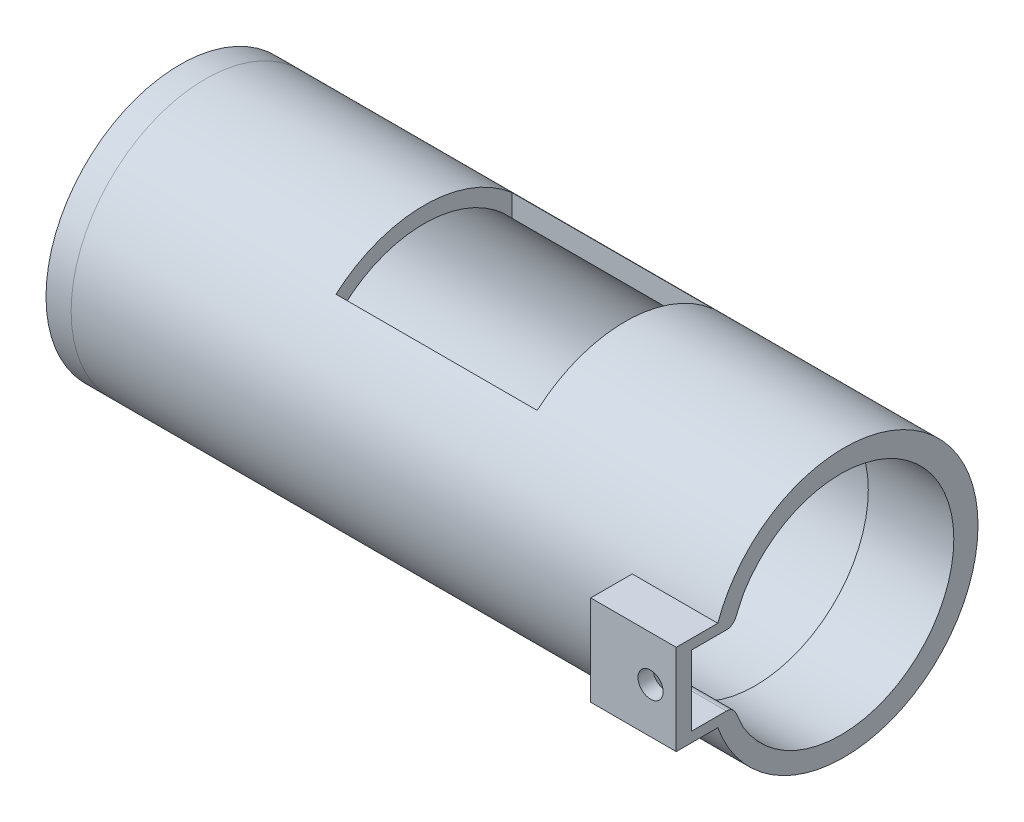
ISO-10303-21;
HEADER;
FILE_DESCRIPTION(('STEP AP214'),'2;1');
FILE_NAME('part.step','',(''),(''),'','','');
FILE_SCHEMA(('AUTOMOTIVE_DESIGN { 1 0 10303 214 1 1 1 1 }'));
ENDSEC;
DATA;
#1=APPLICATION_CONTEXT('core data for automotive mechanical design processes');
#2=APPLICATION_PROTOCOL_DEFINITION('international standard','automotive_design',2000,#1);
#3=PRODUCT_CONTEXT('',#1,'mechanical');
#4=PRODUCT('Part','Part','',(#3));
#5=PRODUCT_RELATED_PRODUCT_CATEGORY('part','',(#4));
#6=PRODUCT_DEFINITION_FORMATION('','',#4);
#7=PRODUCT_DEFINITION_CONTEXT('part definition',#1,'design');
#8=PRODUCT_DEFINITION('design','',#6,#7);
#9=PRODUCT_DEFINITION_SHAPE('','',#8);
#10=(LENGTH_UNIT() NAMED_UNIT(*) SI_UNIT(.MILLI.,.METRE.));
#11=(NAMED_UNIT(*) PLANE_ANGLE_UNIT() SI_UNIT($,.RADIAN.));
#12=(NAMED_UNIT(*) SI_UNIT($,.STERADIAN.) SOLID_ANGLE_UNIT());
#13=UNCERTAINTY_MEASURE_WITH_UNIT(LENGTH_MEASURE(1.E-05),#10,'distance_accuracy_value','');
#14=(GEOMETRIC_REPRESENTATION_CONTEXT(3) GLOBAL_UNCERTAINTY_ASSIGNED_CONTEXT((#13)) GLOBAL_UNIT_ASSIGNED_CONTEXT((#10,
#11,#12)) REPRESENTATION_CONTEXT('',''));
#15=CARTESIAN_POINT('',(0.,0.,0.));
#16=DIRECTION('',(0.,0.,1.));
#17=DIRECTION('',(1.,0.,0.));
#18=AXIS2_PLACEMENT_3D('',#15,#16,#17);
#19=CARTESIAN_POINT('',(-132.,13.0089229634223,32.4850329721471));
#20=DIRECTION('',(1.,0.,0.));
#21=DIRECTION('',(0.,0.,-1.));
#22=AXIS2_PLACEMENT_3D('',#19,#20,#21);
#23=CYLINDRICAL_SURFACE('',#22,26.65);
#24=CARTESIAN_POINT('',(-132.,13.0089229634223,32.4850329721471));
#25=DIRECTION('',(1.,0.,0.));
#26=DIRECTION('',(0.,0.,-1.));
#27=AXIS2_PLACEMENT_3D('',#24,#25,#26);
#28=CIRCLE('',#27,26.65);
#29=CARTESIAN_POINT('',(-132.,13.0089229634223,5.83503297214711));
#30=VERTEX_POINT('',#29);
#31=EDGE_CURVE('E11',#30,#30,#28,.T.);
#32=ORIENTED_EDGE('',*,*,#31,.T.);
#33=EDGE_LOOP('',(#32));
#34=FACE_BOUND('',#33,.T.);
#35=CARTESIAN_POINT('',(-127.,13.0089229634223,32.4850329721471));
#36=DIRECTION('',(1.,0.,0.));
#37=DIRECTION('',(0.,0.,-1.));
#38=AXIS2_PLACEMENT_3D('',#35,#36,#37);
#39=CIRCLE('',#38,26.65);
#40=CARTESIAN_POINT('',(-127.,13.0089229634223,5.83503297214711));
#41=VERTEX_POINT('',#40);
#42=EDGE_CURVE('E47',#41,#41,#39,.T.);
#43=ORIENTED_EDGE('',*,*,#42,.F.);
#44=EDGE_LOOP('',(#43));
#45=FACE_BOUND('',#44,.T.);
#46=ADVANCED_FACE('F44',(#34,#45),#23,.T.);
#47=CARTESIAN_POINT('',(-132.,13.0089229634223,32.4850329721471));
#48=DIRECTION('',(1.,0.,0.));
#49=DIRECTION('',(0.,0.,-1.));
#50=AXIS2_PLACEMENT_3D('',#47,#48,#49);
#51=PLANE('',#50);
#52=CARTESIAN_POINT('',(-132.,13.0089229634223,32.4850329721471));
#53=DIRECTION('',(1.,0.,0.));
#54=DIRECTION('',(0.,0.,-1.));
#55=AXIS2_PLACEMENT_3D('',#52,#53,#54);
#56=CIRCLE('',#55,23.5);
#57=CARTESIAN_POINT('',(-132.,13.0089229634223,8.98503297214711));
#58=VERTEX_POINT('',#57);
#59=EDGE_CURVE('E54',#58,#58,#56,.T.);
#60=ORIENTED_EDGE('',*,*,#59,.T.);
#61=EDGE_LOOP('',(#60));
#62=FACE_BOUND('',#61,.T.);
#63=ORIENTED_EDGE('',*,*,#31,.F.);
#64=EDGE_LOOP('',(#63));
#65=FACE_BOUND('',#64,.T.);
#66=ADVANCED_FACE('F62',(#62,#65),#51,.F.);
#67=CARTESIAN_POINT('',(-127.,13.0089229634223,32.4850329721471));
#68=DIRECTION('',(1.,0.,0.));
#69=DIRECTION('',(0.,0.,-1.));
#70=AXIS2_PLACEMENT_3D('',#67,#68,#69);
#71=PLANE('',#70);
#72=CARTESIAN_POINT('',(-127.,13.0089229634223,32.4850329721471));
#73=DIRECTION('',(1.,0.,0.));
#74=DIRECTION('',(0.,0.,-1.));
#75=AXIS2_PLACEMENT_3D('',#72,#73,#74);
#76=CIRCLE('',#75,23.5);
#77=CARTESIAN_POINT('',(-127.,13.0089229634223,8.98503297214711));
#78=VERTEX_POINT('',#77);
#79=EDGE_CURVE('E56',#78,#78,#76,.T.);
#80=ORIENTED_EDGE('',*,*,#79,.F.);
#81=EDGE_LOOP('',(#80));
#82=FACE_BOUND('',#81,.T.);
#83=ORIENTED_EDGE('',*,*,#42,.T.);
#84=EDGE_LOOP('',(#83));
#85=FACE_BOUND('',#84,.T.);
#86=ADVANCED_FACE('F68',(#82,#85),#71,.T.);
#87=CARTESIAN_POINT('',(-132.,13.0089229634223,32.4850329721471));
#88=DIRECTION('',(1.,0.,0.));
#89=DIRECTION('',(0.,0.,-1.));
#90=AXIS2_PLACEMENT_3D('',#87,#88,#89);
#91=CYLINDRICAL_SURFACE('',#90,23.5);
#92=ORIENTED_EDGE('',*,*,#59,.F.);
#93=EDGE_LOOP('',(#92));
#94=FACE_BOUND('',#93,.T.);
#95=ORIENTED_EDGE('',*,*,#79,.T.);
#96=EDGE_LOOP('',(#95));
#97=FACE_BOUND('',#96,.T.);
#98=ADVANCED_FACE('F65',(#94,#97),#91,.F.);
#99=CLOSED_SHELL('',(#46,#66,#86,#98));
#100=MANIFOLD_SOLID_BREP('B2',#99);
#101=CARTESIAN_POINT('',(-17.,13.0089229634223,32.4850329721471));
#102=DIRECTION('',(1.,0.,0.));
#103=DIRECTION('',(0.,0.,-1.));
#104=AXIS2_PLACEMENT_3D('',#101,#102,#103);
#105=PLANE('',#104);
#106=DIRECTION('',(0.,-0.908416858343051,0.418065558827968));
#107=VECTOR('',#106,1.);
#108=CARTESIAN_POINT('',(-17.,22.6144355272326,53.3569018973315));
#109=LINE('',#108,#107);
#110=CARTESIAN_POINT('',(-17.,24.5089228516636,52.4850335532924));
#111=VERTEX_POINT('',#110);
#112=CARTESIAN_POINT('',(-17.,21.1577918457663,54.0272687549173));
#113=VERTEX_POINT('',#112);
#114=EDGE_CURVE('E342',#111,#113,#109,.T.);
#115=ORIENTED_EDGE('',*,*,#114,.T.);
#116=CARTESIAN_POINT('',(-17.,13.0089229634223,36.3205485699271));
#117=DIRECTION('',(1.,0.,0.));
#118=DIRECTION('',(0.,0.,-1.));
#119=AXIS2_PLACEMENT_3D('',#116,#117,#118);
#120=CIRCLE('',#119,19.4918445451213);
#121=CARTESIAN_POINT('',(-17.,4.86005408107822,54.0272687549173));
#122=VERTEX_POINT('',#121);
#123=EDGE_CURVE('E333',#113,#122,#120,.T.);
#124=ORIENTED_EDGE('',*,*,#123,.T.);
#125=DIRECTION('',(0.,-0.908416858343051,-0.418065558827969));
#126=VECTOR('',#125,1.);
#127=CARTESIAN_POINT('',(-17.,3.40341039961189,53.3569018973315));
#128=LINE('',#127,#126);
#129=CARTESIAN_POINT('',(-17.,1.50892307518099,52.4850335532924));
#130=VERTEX_POINT('',#129);
#131=EDGE_CURVE('E336',#122,#130,#128,.T.);
#132=ORIENTED_EDGE('',*,*,#131,.T.);
#133=CARTESIAN_POINT('',(-17.,13.0089229634223,33.1459538810213));
#134=DIRECTION('',(1.,0.,0.));
#135=DIRECTION('',(0.,0.,-1.));
#136=AXIS2_PLACEMENT_3D('',#133,#134,#135);
#137=CIRCLE('',#136,22.5);
#138=EDGE_CURVE('E339',#130,#111,#137,.T.);
#139=ORIENTED_EDGE('',*,*,#138,.T.);
#140=EDGE_LOOP('',(#115,#124,#132,#139));
#141=FACE_BOUND('',#140,.T.);
#142=CARTESIAN_POINT('',(-17.,13.0089229634223,32.4850329721471));
#143=DIRECTION('',(1.,0.,0.));
#144=DIRECTION('',(0.,0.,-1.));
#145=AXIS2_PLACEMENT_3D('',#142,#143,#144);
#146=CIRCLE('',#145,23.5);
#147=CARTESIAN_POINT('',(-17.,13.0089229634223,8.98503297214711));
#148=VERTEX_POINT('',#147);
#149=EDGE_CURVE('E272',#148,#148,#146,.T.);
#150=ORIENTED_EDGE('',*,*,#149,.F.);
#151=EDGE_LOOP('',(#150));
#152=FACE_BOUND('',#151,.T.);
#153=ADVANCED_FACE('F113',(#141,#152),#105,.F.);
#154=CARTESIAN_POINT('',(-10.2,21.9939229634223,65.8350329721471));
#155=DIRECTION('',(0.,1.,0.));
#156=DIRECTION('',(0.,0.,1.));
#157=AXIS2_PLACEMENT_3D('',#154,#155,#156);
#158=PLANE('',#157);
#159=DIRECTION('',(0.,0.,1.));
#160=VECTOR('',#159,1.);
#161=CARTESIAN_POINT('',(0.,21.9939229634223,65.8350329721471));
#162=LINE('',#161,#160);
#163=CARTESIAN_POINT('',(0.,21.9939229634222,57.574717605478));
#164=VERTEX_POINT('',#163);
#165=CARTESIAN_POINT('',(0.,21.9939229634223,65.8350329721471));
#166=VERTEX_POINT('',#165);
#167=EDGE_CURVE('E409',#164,#166,#162,.T.);
#168=ORIENTED_EDGE('',*,*,#167,.F.);
#169=DIRECTION('',(1.,0.,0.));
#170=VECTOR('',#169,1.);
#171=CARTESIAN_POINT('',(-10.2,21.9939229634222,57.574717605478));
#172=LINE('',#171,#170);
#173=CARTESIAN_POINT('',(-17.,21.9939229634222,57.574717605478));
#174=VERTEX_POINT('',#173);
#175=EDGE_CURVE('E327',#174,#164,#172,.T.);
#176=ORIENTED_EDGE('',*,*,#175,.F.);
#177=DIRECTION('',(0.,0.,1.));
#178=VECTOR('',#177,1.);
#179=CARTESIAN_POINT('',(-17.,21.9939229634222,32.4850329721471));
#180=LINE('',#179,#178);
#181=CARTESIAN_POINT('',(-17.,21.9939229634223,65.8350329721471));
#182=VERTEX_POINT('',#181);
#183=EDGE_CURVE('E351',#174,#182,#180,.T.);
#184=ORIENTED_EDGE('',*,*,#183,.T.);
#185=DIRECTION('',(1.,0.,0.));
#186=VECTOR('',#185,1.);
#187=CARTESIAN_POINT('',(-10.2,21.9939229634223,65.8350329721471));
#188=LINE('',#187,#186);
#189=EDGE_CURVE('E435',#182,#166,#188,.T.);
#190=ORIENTED_EDGE('',*,*,#189,.T.);
#191=EDGE_LOOP('',(#168,#176,#184,#190));
#192=FACE_BOUND('',#191,.T.);
#193=ADVANCED_FACE('F115',(#192),#158,.T.);
#194=CARTESIAN_POINT('',(-10.2,13.0089229634223,32.4850329721471));
#195=DIRECTION('',(1.,0.,0.));
#196=DIRECTION('',(0.,0.,-1.));
#197=AXIS2_PLACEMENT_3D('',#194,#195,#196);
#198=CYLINDRICAL_SURFACE('',#197,26.65);
#199=CARTESIAN_POINT('',(-83.5,13.0089229634223,32.4850329721471));
#200=DIRECTION('',(-1.,0.,0.));
#201=DIRECTION('',(0.,0.,1.));
#202=AXIS2_PLACEMENT_3D('',#199,#200,#201);
#203=CIRCLE('',#202,26.65);
#204=CARTESIAN_POINT('',(-83.5,-7.0901441791095,49.9850329721471));
#205=VERTEX_POINT('',#204);
#206=CARTESIAN_POINT('',(-83.5,-7.0901441791095,14.9850329721471));
#207=VERTEX_POINT('',#206);
#208=EDGE_CURVE('E130',#205,#207,#203,.F.);
#209=ORIENTED_EDGE('',*,*,#208,.F.);
#210=DIRECTION('',(1.,0.,0.));
#211=VECTOR('',#210,1.);
#212=CARTESIAN_POINT('',(-10.2,-7.0901441791095,49.9850329721471));
#213=LINE('',#212,#211);
#214=CARTESIAN_POINT('',(-43.5,-7.0901441791095,49.9850329721471));
#215=VERTEX_POINT('',#214);
#216=EDGE_CURVE('E318',#215,#205,#213,.F.);
#217=ORIENTED_EDGE('',*,*,#216,.F.);
#218=CARTESIAN_POINT('',(-43.5,13.0089229634223,32.4850329721471));
#219=DIRECTION('',(1.,0.,0.));
#220=DIRECTION('',(0.,0.,-1.));
#221=AXIS2_PLACEMENT_3D('',#218,#219,#220);
#222=CIRCLE('',#221,26.65);
#223=CARTESIAN_POINT('',(-43.5,-7.0901441791095,14.9850329721471));
#224=VERTEX_POINT('',#223);
#225=EDGE_CURVE('E298',#224,#215,#222,.F.);
#226=ORIENTED_EDGE('',*,*,#225,.F.);
#227=DIRECTION('',(1.,0.,0.));
#228=VECTOR('',#227,1.);
#229=CARTESIAN_POINT('',(-10.2,-7.0901441791095,14.9850329721471));
#230=LINE('',#229,#228);
#231=EDGE_CURVE('E301',#207,#224,#230,.T.);
#232=ORIENTED_EDGE('',*,*,#231,.F.);
#233=EDGE_LOOP('',(#209,#217,#226,#232));
#234=FACE_BOUND('',#233,.T.);
#235=CARTESIAN_POINT('',(-83.5,33.107990105954,14.9850329721471));
#236=VERTEX_POINT('',#235);
#237=CARTESIAN_POINT('',(-83.5,33.107990105954,49.9850329721471));
#238=VERTEX_POINT('',#237);
#239=EDGE_CURVE('E314',#236,#238,#203,.F.);
#240=ORIENTED_EDGE('',*,*,#239,.F.);
#241=DIRECTION('',(1.,0.,0.));
#242=VECTOR('',#241,1.);
#243=CARTESIAN_POINT('',(-10.2,33.107990105954,14.9850329721471));
#244=LINE('',#243,#242);
#245=CARTESIAN_POINT('',(-43.5,33.107990105954,14.9850329721471));
#246=VERTEX_POINT('',#245);
#247=EDGE_CURVE('E304',#246,#236,#244,.F.);
#248=ORIENTED_EDGE('',*,*,#247,.F.);
#249=CARTESIAN_POINT('',(-43.5,33.107990105954,49.9850329721471));
#250=VERTEX_POINT('',#249);
#251=EDGE_CURVE('E138',#250,#246,#222,.F.);
#252=ORIENTED_EDGE('',*,*,#251,.F.);
#253=DIRECTION('',(1.,0.,0.));
#254=VECTOR('',#253,1.);
#255=CARTESIAN_POINT('',(-10.2,33.107990105954,49.9850329721471));
#256=LINE('',#255,#254);
#257=EDGE_CURVE('E316',#238,#250,#256,.T.);
#258=ORIENTED_EDGE('',*,*,#257,.F.);
#259=EDGE_LOOP('',(#240,#248,#252,#258));
#260=FACE_BOUND('',#259,.T.);
#261=CARTESIAN_POINT('',(0.,13.0089229634223,32.4850329721471));
#262=DIRECTION('',(1.,0.,0.));
#263=DIRECTION('',(0.,0.,-1.));
#264=AXIS2_PLACEMENT_3D('',#261,#262,#263);
#265=CIRCLE('',#264,26.65);
#266=CARTESIAN_POINT('',(0.,4.02392296342226,57.574717605478));
#267=VERTEX_POINT('',#266);
#268=EDGE_CURVE('E432',#267,#164,#265,.T.);
#269=ORIENTED_EDGE('',*,*,#268,.F.);
#270=DIRECTION('',(1.,0.,0.));
#271=VECTOR('',#270,1.);
#272=CARTESIAN_POINT('',(-10.2,4.02392296342226,57.574717605478));
#273=LINE('',#272,#271);
#274=CARTESIAN_POINT('',(-17.,4.02392296342227,57.574717605478));
#275=VERTEX_POINT('',#274);
#276=EDGE_CURVE('E437',#275,#267,#273,.T.);
#277=ORIENTED_EDGE('',*,*,#276,.F.);
#278=CARTESIAN_POINT('',(-17.,13.0089229634223,32.4850329721471));
#279=DIRECTION('',(1.,0.,0.));
#280=DIRECTION('',(0.,0.,-1.));
#281=AXIS2_PLACEMENT_3D('',#278,#279,#280);
#282=CIRCLE('',#281,26.65);
#283=EDGE_CURVE('E324',#174,#275,#282,.T.);
#284=ORIENTED_EDGE('',*,*,#283,.F.);
#285=ORIENTED_EDGE('',*,*,#175,.T.);
#286=EDGE_LOOP('',(#269,#277,#284,#285));
#287=FACE_BOUND('',#286,.T.);
#288=CARTESIAN_POINT('',(-127.,13.0089229634223,32.4850329721471));
#289=DIRECTION('',(1.,0.,0.));
#290=DIRECTION('',(0.,0.,-1.));
#291=AXIS2_PLACEMENT_3D('',#288,#289,#290);
#292=CIRCLE('',#291,26.65);
#293=CARTESIAN_POINT('',(-127.,13.0089229634223,5.83503297214711));
#294=VERTEX_POINT('',#293);
#295=EDGE_CURVE('E328',#294,#294,#292,.T.);
#296=ORIENTED_EDGE('',*,*,#295,.T.);
#297=EDGE_LOOP('',(#296));
#298=FACE_BOUND('',#297,.T.);
#299=ADVANCED_FACE('F455',(#234,#260,#287,#298),#198,.T.);
#300=CARTESIAN_POINT('',(-10.2,4.02392296342226,65.8350329721471));
#301=DIRECTION('',(0.,-1.,0.));
#302=DIRECTION('',(0.,0.,-1.));
#303=AXIS2_PLACEMENT_3D('',#300,#301,#302);
#304=PLANE('',#303);
#305=DIRECTION('',(0.,0.,-1.));
#306=VECTOR('',#305,1.);
#307=CARTESIAN_POINT('',(0.,4.02392296342226,65.8350329721471));
#308=LINE('',#307,#306);
#309=CARTESIAN_POINT('',(0.,4.02392296342226,65.8350329721471));
#310=VERTEX_POINT('',#309);
#311=EDGE_CURVE('E429',#310,#267,#308,.T.);
#312=ORIENTED_EDGE('',*,*,#311,.F.);
#313=DIRECTION('',(1.,0.,0.));
#314=VECTOR('',#313,1.);
#315=CARTESIAN_POINT('',(-10.2,4.02392296342226,65.8350329721471));
#316=LINE('',#315,#314);
#317=CARTESIAN_POINT('',(-17.,4.02392296342226,65.8350329721471));
#318=VERTEX_POINT('',#317);
#319=EDGE_CURVE('E439',#318,#310,#316,.T.);
#320=ORIENTED_EDGE('',*,*,#319,.F.);
#321=DIRECTION('',(0.,0.,-1.));
#322=VECTOR('',#321,1.);
#323=CARTESIAN_POINT('',(-17.,4.02392296342226,32.4850329721471));
#324=LINE('',#323,#322);
#325=EDGE_CURVE('E359',#318,#275,#324,.T.);
#326=ORIENTED_EDGE('',*,*,#325,.T.);
#327=ORIENTED_EDGE('',*,*,#276,.T.);
#328=EDGE_LOOP('',(#312,#320,#326,#327));
#329=FACE_BOUND('',#328,.T.);
#330=ADVANCED_FACE('F461',(#329),#304,.T.);
#331=CARTESIAN_POINT('',(-10.2,21.9939229634223,65.8350329721471));
#332=DIRECTION('',(0.,0.,1.));
#333=DIRECTION('',(1.,0.,0.));
#334=AXIS2_PLACEMENT_3D('',#331,#332,#333);
#335=PLANE('',#334);
#336=CARTESIAN_POINT('',(-5.1,13.0089229634223,65.8350329721471));
#337=DIRECTION('',(0.,0.,1.));
#338=DIRECTION('',(1.,0.,0.));
#339=AXIS2_PLACEMENT_3D('',#336,#337,#338);
#340=CIRCLE('',#339,2.5);
#341=CARTESIAN_POINT('',(-2.6,13.0089229634223,65.8350329721471));
#342=VERTEX_POINT('',#341);
#343=EDGE_CURVE('E362',#342,#342,#340,.T.);
#344=ORIENTED_EDGE('',*,*,#343,.F.);
#345=EDGE_LOOP('',(#344));
#346=FACE_BOUND('',#345,.T.);
#347=DIRECTION('',(0.,-1.,0.));
#348=VECTOR('',#347,1.);
#349=CARTESIAN_POINT('',(0.,21.9939229634223,65.8350329721471));
#350=LINE('',#349,#348);
#351=EDGE_CURVE('E426',#166,#310,#350,.T.);
#352=ORIENTED_EDGE('',*,*,#351,.F.);
#353=ORIENTED_EDGE('',*,*,#189,.F.);
#354=DIRECTION('',(0.,-1.,0.));
#355=VECTOR('',#354,1.);
#356=CARTESIAN_POINT('',(-17.,13.0089229634223,65.8350329721471));
#357=LINE('',#356,#355);
#358=EDGE_CURVE('E356',#182,#318,#357,.T.);
#359=ORIENTED_EDGE('',*,*,#358,.T.);
#360=ORIENTED_EDGE('',*,*,#319,.T.);
#361=EDGE_LOOP('',(#352,#353,#359,#360));
#362=FACE_BOUND('',#361,.T.);
#363=ADVANCED_FACE('F448',(#346,#362),#335,.T.);
#364=CARTESIAN_POINT('',(0.,13.0089229634223,32.4850329721471));
#365=DIRECTION('',(1.,0.,0.));
#366=DIRECTION('',(0.,0.,-1.));
#367=AXIS2_PLACEMENT_3D('',#364,#365,#366);
#368=PLANE('',#367);
#369=CARTESIAN_POINT('',(0.,13.0089229634223,33.1459538810213));
#370=DIRECTION('',(1.,0.,0.));
#371=DIRECTION('',(0.,0.,1.));
#372=AXIS2_PLACEMENT_3D('',#369,#370,#371);
#373=CIRCLE('',#372,22.5);
#374=CARTESIAN_POINT('',(0.,1.50892307518098,52.4850335532924));
#375=VERTEX_POINT('',#374);
#376=CARTESIAN_POINT('',(0.,24.5089228516636,52.4850335532924));
#377=VERTEX_POINT('',#376);
#378=EDGE_CURVE('E366',#375,#377,#373,.T.);
#379=ORIENTED_EDGE('',*,*,#378,.F.);
#380=DIRECTION('',(0.,-0.908416858343049,-0.418065558827971));
#381=VECTOR('',#380,1.);
#382=CARTESIAN_POINT('',(0.,4.8600540810782,54.0272687549173));
#383=LINE('',#382,#381);
#384=CARTESIAN_POINT('',(0.,4.8600540810782,54.0272687549173));
#385=VERTEX_POINT('',#384);
#386=EDGE_CURVE('E373',#385,#375,#383,.T.);
#387=ORIENTED_EDGE('',*,*,#386,.F.);
#388=CARTESIAN_POINT('',(0.,4.02392296342226,55.8441024716034));
#389=DIRECTION('',(-1.,0.,0.));
#390=DIRECTION('',(0.,0.,-1.));
#391=AXIS2_PLACEMENT_3D('',#388,#389,#390);
#392=CIRCLE('',#391,1.99999999999999);
#393=CARTESIAN_POINT('',(0.,6.02392296342226,55.8441024716034));
#394=VERTEX_POINT('',#393);
#395=EDGE_CURVE('E402',#394,#385,#392,.T.);
#396=ORIENTED_EDGE('',*,*,#395,.F.);
#397=DIRECTION('',(0.,0.,-1.));
#398=VECTOR('',#397,1.);
#399=CARTESIAN_POINT('',(0.,6.02392296342226,62.8350329721471));
#400=LINE('',#399,#398);
#401=CARTESIAN_POINT('',(0.,6.02392296342226,62.8350329721471));
#402=VERTEX_POINT('',#401);
#403=EDGE_CURVE('E399',#402,#394,#400,.T.);
#404=ORIENTED_EDGE('',*,*,#403,.F.);
#405=DIRECTION('',(0.,-1.,0.));
#406=VECTOR('',#405,1.);
#407=CARTESIAN_POINT('',(0.,19.9939229634223,62.8350329721471));
#408=LINE('',#407,#406);
#409=CARTESIAN_POINT('',(0.,19.9939229634223,62.8350329721471));
#410=VERTEX_POINT('',#409);
#411=EDGE_CURVE('E396',#410,#402,#408,.T.);
#412=ORIENTED_EDGE('',*,*,#411,.F.);
#413=DIRECTION('',(0.,0.,1.));
#414=VECTOR('',#413,1.);
#415=CARTESIAN_POINT('',(0.,19.9939229634223,55.8441024716034));
#416=LINE('',#415,#414);
#417=CARTESIAN_POINT('',(0.,19.9939229634223,55.8441024716034));
#418=VERTEX_POINT('',#417);
#419=EDGE_CURVE('E393',#418,#410,#416,.T.);
#420=ORIENTED_EDGE('',*,*,#419,.F.);
#421=CARTESIAN_POINT('',(0.,21.9939229634223,55.8441024716034));
#422=DIRECTION('',(-1.,0.,0.));
#423=DIRECTION('',(0.,0.,-1.));
#424=AXIS2_PLACEMENT_3D('',#421,#422,#423);
#425=CIRCLE('',#424,1.99999999999999);
#426=CARTESIAN_POINT('',(0.,21.1577918457663,54.0272687549173));
#427=VERTEX_POINT('',#426);
#428=EDGE_CURVE('E390',#427,#418,#425,.T.);
#429=ORIENTED_EDGE('',*,*,#428,.F.);
#430=DIRECTION('',(0.,-0.908416858343051,0.418065558827969));
#431=VECTOR('',#430,1.);
#432=CARTESIAN_POINT('',(0.,24.5089228516636,52.4850335532924));
#433=LINE('',#432,#431);
#434=EDGE_CURVE('E387',#377,#427,#433,.T.);
#435=ORIENTED_EDGE('',*,*,#434,.F.);
#436=EDGE_LOOP('',(#379,#387,#396,#404,#412,#420,#429,#435));
#437=FACE_BOUND('',#436,.T.);
#438=ORIENTED_EDGE('',*,*,#167,.T.);
#439=ORIENTED_EDGE('',*,*,#351,.T.);
#440=ORIENTED_EDGE('',*,*,#311,.T.);
#441=ORIENTED_EDGE('',*,*,#268,.T.);
#442=EDGE_LOOP('',(#438,#439,#440,#441));
#443=FACE_BOUND('',#442,.T.);
#444=ADVANCED_FACE('F451',(#437,#443),#368,.T.);
#445=CARTESIAN_POINT('',(-10.2,13.0089229634223,33.1459538810213));
#446=DIRECTION('',(1.,0.,0.));
#447=DIRECTION('',(0.,0.,-1.));
#448=AXIS2_PLACEMENT_3D('',#445,#446,#447);
#449=CYLINDRICAL_SURFACE('',#448,22.5);
#450=ORIENTED_EDGE('',*,*,#378,.T.);
#451=DIRECTION('',(1.,0.,0.));
#452=VECTOR('',#451,1.);
#453=CARTESIAN_POINT('',(-10.2,24.5089228516636,52.4850335532924));
#454=LINE('',#453,#452);
#455=EDGE_CURVE('E385',#111,#377,#454,.T.);
#456=ORIENTED_EDGE('',*,*,#455,.F.);
#457=ORIENTED_EDGE('',*,*,#138,.F.);
#458=DIRECTION('',(1.,0.,0.));
#459=VECTOR('',#458,1.);
#460=CARTESIAN_POINT('',(-10.2,1.50892307518098,52.4850335532924));
#461=LINE('',#460,#459);
#462=EDGE_CURVE('E407',#130,#375,#461,.T.);
#463=ORIENTED_EDGE('',*,*,#462,.T.);
#464=EDGE_LOOP('',(#450,#456,#457,#463));
#465=FACE_BOUND('',#464,.T.);
#466=ADVANCED_FACE('F504',(#465),#449,.F.);
#467=CARTESIAN_POINT('',(-10.2,4.8600540810782,54.0272687549173));
#468=DIRECTION('',(0.,-0.418065558827971,0.908416858343049));
#469=DIRECTION('',(0.,-0.90841685834305,-0.418065558827971));
#470=AXIS2_PLACEMENT_3D('',#467,#468,#469);
#471=PLANE('',#470);
#472=ORIENTED_EDGE('',*,*,#386,.T.);
#473=ORIENTED_EDGE('',*,*,#462,.F.);
#474=ORIENTED_EDGE('',*,*,#131,.F.);
#475=DIRECTION('',(1.,0.,0.));
#476=VECTOR('',#475,1.);
#477=CARTESIAN_POINT('',(-17.,4.86005408107822,54.0272687549173));
#478=LINE('',#477,#476);
#479=CARTESIAN_POINT('',(-10.2,4.86005408107822,54.0272687549173));
#480=VERTEX_POINT('',#479);
#481=EDGE_CURVE('E345',#122,#480,#478,.T.);
#482=ORIENTED_EDGE('',*,*,#481,.T.);
#483=DIRECTION('',(1.,0.,0.));
#484=VECTOR('',#483,1.);
#485=CARTESIAN_POINT('',(-10.2,4.8600540810782,54.0272687549173));
#486=LINE('',#485,#484);
#487=EDGE_CURVE('E410',#480,#385,#486,.T.);
#488=ORIENTED_EDGE('',*,*,#487,.T.);
#489=EDGE_LOOP('',(#472,#473,#474,#482,#488));
#490=FACE_BOUND('',#489,.T.);
#491=ADVANCED_FACE('F500',(#490),#471,.F.);
#492=CARTESIAN_POINT('',(-10.2,4.02392296342226,55.8441024716034));
#493=DIRECTION('',(1.,0.,0.));
#494=DIRECTION('',(0.,0.,-1.));
#495=AXIS2_PLACEMENT_3D('',#492,#493,#494);
#496=CYLINDRICAL_SURFACE('',#495,1.99999999999999);
#497=ORIENTED_EDGE('',*,*,#395,.T.);
#498=ORIENTED_EDGE('',*,*,#487,.F.);
#499=CARTESIAN_POINT('',(-10.2,4.02392296342226,55.8441024716034));
#500=DIRECTION('',(-1.,0.,0.));
#501=DIRECTION('',(0.,0.,-1.));
#502=AXIS2_PLACEMENT_3D('',#499,#500,#501);
#503=CIRCLE('',#502,1.99999999999999);
#504=CARTESIAN_POINT('',(-10.2,6.02392296342226,55.8441024716034));
#505=VERTEX_POINT('',#504);
#506=EDGE_CURVE('E382',#505,#480,#503,.T.);
#507=ORIENTED_EDGE('',*,*,#506,.F.);
#508=DIRECTION('',(1.,0.,0.));
#509=VECTOR('',#508,1.);
#510=CARTESIAN_POINT('',(-10.2,6.02392296342226,55.8441024716034));
#511=LINE('',#510,#509);
#512=EDGE_CURVE('E412',#505,#394,#511,.T.);
#513=ORIENTED_EDGE('',*,*,#512,.T.);
#514=EDGE_LOOP('',(#497,#498,#507,#513));
#515=FACE_BOUND('',#514,.T.);
#516=ADVANCED_FACE('F503',(#515),#496,.T.);
#517=CARTESIAN_POINT('',(-10.2,6.02392296342226,62.8350329721471));
#518=DIRECTION('',(0.,-1.,0.));
#519=DIRECTION('',(0.,0.,-1.));
#520=AXIS2_PLACEMENT_3D('',#517,#518,#519);
#521=PLANE('',#520);
#522=ORIENTED_EDGE('',*,*,#403,.T.);
#523=ORIENTED_EDGE('',*,*,#512,.F.);
#524=DIRECTION('',(0.,0.,-1.));
#525=VECTOR('',#524,1.);
#526=CARTESIAN_POINT('',(-10.2,6.02392296342226,62.8350329721471));
#527=LINE('',#526,#525);
#528=CARTESIAN_POINT('',(-10.2,6.02392296342226,62.8350329721471));
#529=VERTEX_POINT('',#528);
#530=EDGE_CURVE('E379',#529,#505,#527,.T.);
#531=ORIENTED_EDGE('',*,*,#530,.F.);
#532=DIRECTION('',(1.,0.,0.));
#533=VECTOR('',#532,1.);
#534=CARTESIAN_POINT('',(-10.2,6.02392296342226,62.8350329721471));
#535=LINE('',#534,#533);
#536=EDGE_CURVE('E414',#529,#402,#535,.T.);
#537=ORIENTED_EDGE('',*,*,#536,.T.);
#538=EDGE_LOOP('',(#522,#523,#531,#537));
#539=FACE_BOUND('',#538,.T.);
#540=ADVANCED_FACE('F508',(#539),#521,.F.);
#541=CARTESIAN_POINT('',(-10.2,19.9939229634223,62.8350329721471));
#542=DIRECTION('',(0.,0.,1.));
#543=DIRECTION('',(1.,0.,0.));
#544=AXIS2_PLACEMENT_3D('',#541,#542,#543);
#545=PLANE('',#544);
#546=CARTESIAN_POINT('',(-5.1,13.0089229634223,62.8350329721471));
#547=DIRECTION('',(0.,0.,1.));
#548=DIRECTION('',(1.,0.,0.));
#549=AXIS2_PLACEMENT_3D('',#546,#547,#548);
#550=CIRCLE('',#549,2.5);
#551=CARTESIAN_POINT('',(-2.6,13.0089229634223,62.8350329721471));
#552=VERTEX_POINT('',#551);
#553=EDGE_CURVE('E363',#552,#552,#550,.T.);
#554=ORIENTED_EDGE('',*,*,#553,.T.);
#555=EDGE_LOOP('',(#554));
#556=FACE_BOUND('',#555,.T.);
#557=ORIENTED_EDGE('',*,*,#411,.T.);
#558=ORIENTED_EDGE('',*,*,#536,.F.);
#559=DIRECTION('',(0.,-1.,0.));
#560=VECTOR('',#559,1.);
#561=CARTESIAN_POINT('',(-10.2,19.9939229634223,62.8350329721471));
#562=LINE('',#561,#560);
#563=CARTESIAN_POINT('',(-10.2,19.9939229634223,62.8350329721471));
#564=VERTEX_POINT('',#563);
#565=EDGE_CURVE('E376',#564,#529,#562,.T.);
#566=ORIENTED_EDGE('',*,*,#565,.F.);
#567=DIRECTION('',(1.,0.,0.));
#568=VECTOR('',#567,1.);
#569=CARTESIAN_POINT('',(-10.2,19.9939229634223,62.8350329721471));
#570=LINE('',#569,#568);
#571=EDGE_CURVE('E416',#564,#410,#570,.T.);
#572=ORIENTED_EDGE('',*,*,#571,.T.);
#573=EDGE_LOOP('',(#557,#558,#566,#572));
#574=FACE_BOUND('',#573,.T.);
#575=ADVANCED_FACE('F512',(#556,#574),#545,.F.);
#576=CARTESIAN_POINT('',(-10.2,19.9939229634223,55.8441024716034));
#577=DIRECTION('',(0.,1.,0.));
#578=DIRECTION('',(0.,0.,1.));
#579=AXIS2_PLACEMENT_3D('',#576,#577,#578);
#580=PLANE('',#579);
#581=ORIENTED_EDGE('',*,*,#419,.T.);
#582=ORIENTED_EDGE('',*,*,#571,.F.);
#583=DIRECTION('',(0.,0.,1.));
#584=VECTOR('',#583,1.);
#585=CARTESIAN_POINT('',(-10.2,19.9939229634223,55.8441024716034));
#586=LINE('',#585,#584);
#587=CARTESIAN_POINT('',(-10.2,19.9939229634223,55.8441024716034));
#588=VERTEX_POINT('',#587);
#589=EDGE_CURVE('E372',#588,#564,#586,.T.);
#590=ORIENTED_EDGE('',*,*,#589,.F.);
#591=DIRECTION('',(1.,0.,0.));
#592=VECTOR('',#591,1.);
#593=CARTESIAN_POINT('',(-10.2,19.9939229634223,55.8441024716034));
#594=LINE('',#593,#592);
#595=EDGE_CURVE('E418',#588,#418,#594,.T.);
#596=ORIENTED_EDGE('',*,*,#595,.T.);
#597=EDGE_LOOP('',(#581,#582,#590,#596));
#598=FACE_BOUND('',#597,.T.);
#599=ADVANCED_FACE('F516',(#598),#580,.F.);
#600=CARTESIAN_POINT('',(-10.2,21.9939229634223,55.8441024716034));
#601=DIRECTION('',(1.,0.,0.));
#602=DIRECTION('',(0.,0.,-1.));
#603=AXIS2_PLACEMENT_3D('',#600,#601,#602);
#604=CYLINDRICAL_SURFACE('',#603,1.99999999999999);
#605=ORIENTED_EDGE('',*,*,#428,.T.);
#606=ORIENTED_EDGE('',*,*,#595,.F.);
#607=CARTESIAN_POINT('',(-10.2,21.9939229634223,55.8441024716034));
#608=DIRECTION('',(-1.,0.,0.));
#609=DIRECTION('',(0.,0.,-1.));
#610=AXIS2_PLACEMENT_3D('',#607,#608,#609);
#611=CIRCLE('',#610,1.99999999999999);
#612=CARTESIAN_POINT('',(-10.2,21.1577918457663,54.0272687549173));
#613=VERTEX_POINT('',#612);
#614=EDGE_CURVE('E369',#613,#588,#611,.T.);
#615=ORIENTED_EDGE('',*,*,#614,.F.);
#616=DIRECTION('',(1.,0.,0.));
#617=VECTOR('',#616,1.);
#618=CARTESIAN_POINT('',(-10.2,21.1577918457663,54.0272687549173));
#619=LINE('',#618,#617);
#620=EDGE_CURVE('E420',#613,#427,#619,.T.);
#621=ORIENTED_EDGE('',*,*,#620,.T.);
#622=EDGE_LOOP('',(#605,#606,#615,#621));
#623=FACE_BOUND('',#622,.T.);
#624=ADVANCED_FACE('F520',(#623),#604,.T.);
#625=CARTESIAN_POINT('',(-10.2,24.5089228516636,52.4850335532924));
#626=DIRECTION('',(0.,0.418065558827969,0.908416858343051));
#627=DIRECTION('',(0.,-0.908416858343051,0.418065558827969));
#628=AXIS2_PLACEMENT_3D('',#625,#626,#627);
#629=PLANE('',#628);
#630=ORIENTED_EDGE('',*,*,#434,.T.);
#631=ORIENTED_EDGE('',*,*,#620,.F.);
#632=DIRECTION('',(1.,0.,0.));
#633=VECTOR('',#632,1.);
#634=CARTESIAN_POINT('',(-17.,21.1577918457663,54.0272687549173));
#635=LINE('',#634,#633);
#636=EDGE_CURVE('E348',#113,#613,#635,.T.);
#637=ORIENTED_EDGE('',*,*,#636,.F.);
#638=ORIENTED_EDGE('',*,*,#114,.F.);
#639=ORIENTED_EDGE('',*,*,#455,.T.);
#640=EDGE_LOOP('',(#630,#631,#637,#638,#639));
#641=FACE_BOUND('',#640,.T.);
#642=ADVANCED_FACE('F495',(#641),#629,.F.);
#643=CARTESIAN_POINT('',(-5.1,13.0089229634223,62.8350329721471));
#644=DIRECTION('',(0.,0.,1.));
#645=DIRECTION('',(1.,0.,0.));
#646=AXIS2_PLACEMENT_3D('',#643,#644,#645);
#647=CYLINDRICAL_SURFACE('',#646,2.5);
#648=ORIENTED_EDGE('',*,*,#553,.F.);
#649=EDGE_LOOP('',(#648));
#650=FACE_BOUND('',#649,.T.);
#651=ORIENTED_EDGE('',*,*,#343,.T.);
#652=EDGE_LOOP('',(#651));
#653=FACE_BOUND('',#652,.T.);
#654=ADVANCED_FACE('F490',(#650,#653),#647,.F.);
#655=CARTESIAN_POINT('',(-10.2,13.0089229634223,32.4850329721471));
#656=DIRECTION('',(1.,0.,0.));
#657=DIRECTION('',(0.,0.,-1.));
#658=AXIS2_PLACEMENT_3D('',#655,#656,#657);
#659=PLANE('',#658);
#660=CARTESIAN_POINT('',(-10.2,13.0089229634223,36.3205485699271));
#661=DIRECTION('',(1.,0.,0.));
#662=DIRECTION('',(0.,0.,-1.));
#663=AXIS2_PLACEMENT_3D('',#660,#661,#662);
#664=CIRCLE('',#663,19.4918445451213);
#665=EDGE_CURVE('E331',#613,#480,#664,.T.);
#666=ORIENTED_EDGE('',*,*,#665,.F.);
#667=ORIENTED_EDGE('',*,*,#614,.T.);
#668=ORIENTED_EDGE('',*,*,#589,.T.);
#669=ORIENTED_EDGE('',*,*,#565,.T.);
#670=ORIENTED_EDGE('',*,*,#530,.T.);
#671=ORIENTED_EDGE('',*,*,#506,.T.);
#672=EDGE_LOOP('',(#666,#667,#668,#669,#670,#671));
#673=FACE_BOUND('',#672,.T.);
#674=ADVANCED_FACE('F483',(#673),#659,.T.);
#675=ORIENTED_EDGE('',*,*,#183,.F.);
#676=ORIENTED_EDGE('',*,*,#283,.T.);
#677=ORIENTED_EDGE('',*,*,#325,.F.);
#678=ORIENTED_EDGE('',*,*,#358,.F.);
#679=EDGE_LOOP('',(#675,#676,#677,#678));
#680=FACE_BOUND('',#679,.T.);
#681=ADVANCED_FACE('F458',(#680),#105,.F.);
#682=CARTESIAN_POINT('',(-17.,13.0089229634223,36.3205485699271));
#683=DIRECTION('',(1.,0.,0.));
#684=DIRECTION('',(0.,0.,-1.));
#685=AXIS2_PLACEMENT_3D('',#682,#683,#684);
#686=CYLINDRICAL_SURFACE('',#685,19.4918445451213);
#687=ORIENTED_EDGE('',*,*,#665,.T.);
#688=ORIENTED_EDGE('',*,*,#481,.F.);
#689=ORIENTED_EDGE('',*,*,#123,.F.);
#690=ORIENTED_EDGE('',*,*,#636,.T.);
#691=EDGE_LOOP('',(#687,#688,#689,#690));
#692=FACE_BOUND('',#691,.T.);
#693=ADVANCED_FACE('F482',(#692),#686,.F.);
#694=CARTESIAN_POINT('',(-127.,13.0089229634223,32.4850329721471));
#695=DIRECTION('',(1.,0.,0.));
#696=DIRECTION('',(0.,0.,-1.));
#697=AXIS2_PLACEMENT_3D('',#694,#695,#696);
#698=PLANE('',#697);
#699=CARTESIAN_POINT('',(-127.,13.0089229634223,32.4850329721471));
#700=DIRECTION('',(1.,0.,0.));
#701=DIRECTION('',(0.,0.,-1.));
#702=AXIS2_PLACEMENT_3D('',#699,#700,#701);
#703=CIRCLE('',#702,23.5);
#704=CARTESIAN_POINT('',(-127.,13.0089229634223,8.98503297214711));
#705=VERTEX_POINT('',#704);
#706=EDGE_CURVE('E321',#705,#705,#703,.T.);
#707=ORIENTED_EDGE('',*,*,#706,.T.);
#708=EDGE_LOOP('',(#707));
#709=FACE_BOUND('',#708,.T.);
#710=ORIENTED_EDGE('',*,*,#295,.F.);
#711=EDGE_LOOP('',(#710));
#712=FACE_BOUND('',#711,.T.);
#713=ADVANCED_FACE('F488',(#709,#712),#698,.F.);
#714=CARTESIAN_POINT('',(-127.,13.0089229634223,32.4850329721471));
#715=DIRECTION('',(1.,0.,0.));
#716=DIRECTION('',(0.,0.,-1.));
#717=AXIS2_PLACEMENT_3D('',#714,#715,#716);
#718=CYLINDRICAL_SURFACE('',#717,23.5);
#719=DIRECTION('',(1.,0.,0.));
#720=VECTOR('',#719,1.);
#721=CARTESIAN_POINT('',(-127.,28.6933101047804,49.9850329721471));
#722=LINE('',#721,#720);
#723=CARTESIAN_POINT('',(-83.5,28.6933101047804,49.9850329721471));
#724=VERTEX_POINT('',#723);
#725=CARTESIAN_POINT('',(-43.5,28.6933101047804,49.9850329721471));
#726=VERTEX_POINT('',#725);
#727=EDGE_CURVE('E117',#724,#726,#722,.T.);
#728=ORIENTED_EDGE('',*,*,#727,.T.);
#729=CARTESIAN_POINT('',(-43.5,13.0089229634223,32.4850329721471));
#730=DIRECTION('',(1.,0.,0.));
#731=DIRECTION('',(0.,0.,-1.));
#732=AXIS2_PLACEMENT_3D('',#729,#730,#731);
#733=CIRCLE('',#732,23.5);
#734=CARTESIAN_POINT('',(-43.5,28.6933101047804,14.9850329721471));
#735=VERTEX_POINT('',#734);
#736=EDGE_CURVE('E42',#726,#735,#733,.F.);
#737=ORIENTED_EDGE('',*,*,#736,.T.);
#738=DIRECTION('',(1.,0.,0.));
#739=VECTOR('',#738,1.);
#740=CARTESIAN_POINT('',(-127.,28.6933101047804,14.9850329721471));
#741=LINE('',#740,#739);
#742=CARTESIAN_POINT('',(-83.5,28.6933101047804,14.9850329721471));
#743=VERTEX_POINT('',#742);
#744=EDGE_CURVE('E287',#735,#743,#741,.F.);
#745=ORIENTED_EDGE('',*,*,#744,.T.);
#746=CARTESIAN_POINT('',(-83.5,13.0089229634223,32.4850329721471));
#747=DIRECTION('',(-1.,0.,0.));
#748=DIRECTION('',(0.,0.,1.));
#749=AXIS2_PLACEMENT_3D('',#746,#747,#748);
#750=CIRCLE('',#749,23.5);
#751=EDGE_CURVE('E284',#743,#724,#750,.F.);
#752=ORIENTED_EDGE('',*,*,#751,.T.);
#753=EDGE_LOOP('',(#728,#737,#745,#752));
#754=FACE_BOUND('',#753,.T.);
#755=DIRECTION('',(1.,0.,0.));
#756=VECTOR('',#755,1.);
#757=CARTESIAN_POINT('',(-127.,-2.67546417793586,14.9850329721471));
#758=LINE('',#757,#756);
#759=CARTESIAN_POINT('',(-83.5,-2.67546417793586,14.9850329721471));
#760=VERTEX_POINT('',#759);
#761=CARTESIAN_POINT('',(-43.5,-2.67546417793586,14.9850329721471));
#762=VERTEX_POINT('',#761);
#763=EDGE_CURVE('E261',#760,#762,#758,.T.);
#764=ORIENTED_EDGE('',*,*,#763,.T.);
#765=CARTESIAN_POINT('',(-43.5,-2.67546417793586,49.9850329721471));
#766=VERTEX_POINT('',#765);
#767=EDGE_CURVE('E123',#762,#766,#733,.F.);
#768=ORIENTED_EDGE('',*,*,#767,.T.);
#769=DIRECTION('',(1.,0.,0.));
#770=VECTOR('',#769,1.);
#771=CARTESIAN_POINT('',(-127.,-2.67546417793586,49.9850329721471));
#772=LINE('',#771,#770);
#773=CARTESIAN_POINT('',(-83.5,-2.67546417793586,49.9850329721471));
#774=VERTEX_POINT('',#773);
#775=EDGE_CURVE('E282',#766,#774,#772,.F.);
#776=ORIENTED_EDGE('',*,*,#775,.T.);
#777=EDGE_CURVE('E271',#774,#760,#750,.F.);
#778=ORIENTED_EDGE('',*,*,#777,.T.);
#779=EDGE_LOOP('',(#764,#768,#776,#778));
#780=FACE_BOUND('',#779,.T.);
#781=ORIENTED_EDGE('',*,*,#706,.F.);
#782=EDGE_LOOP('',(#781));
#783=FACE_BOUND('',#782,.T.);
#784=ORIENTED_EDGE('',*,*,#149,.T.);
#785=EDGE_LOOP('',(#784));
#786=FACE_BOUND('',#785,.T.);
#787=ADVANCED_FACE('F280',(#754,#780,#783,#786),#718,.F.);
#788=CARTESIAN_POINT('',(-83.5,-13.6410770365777,14.9850329721471));
#789=DIRECTION('',(0.,0.,-1.));
#790=DIRECTION('',(-1.,0.,0.));
#791=AXIS2_PLACEMENT_3D('',#788,#789,#790);
#792=PLANE('',#791);
#793=ORIENTED_EDGE('',*,*,#231,.T.);
#794=DIRECTION('',(0.,1.,0.));
#795=VECTOR('',#794,1.);
#796=CARTESIAN_POINT('',(-43.5,-13.6410770365777,14.9850329721471));
#797=LINE('',#796,#795);
#798=EDGE_CURVE('E266',#224,#762,#797,.T.);
#799=ORIENTED_EDGE('',*,*,#798,.T.);
#800=ORIENTED_EDGE('',*,*,#763,.F.);
#801=DIRECTION('',(0.,1.,0.));
#802=VECTOR('',#801,1.);
#803=CARTESIAN_POINT('',(-83.5,-13.6410770365777,14.9850329721471));
#804=LINE('',#803,#802);
#805=EDGE_CURVE('E263',#207,#760,#804,.T.);
#806=ORIENTED_EDGE('',*,*,#805,.F.);
#807=EDGE_LOOP('',(#793,#799,#800,#806));
#808=FACE_BOUND('',#807,.T.);
#809=ADVANCED_FACE('F262',(#808),#792,.F.);
#810=CARTESIAN_POINT('',(-83.5,-13.6410770365777,14.9850329721471));
#811=DIRECTION('',(-1.,0.,0.));
#812=DIRECTION('',(0.,0.,1.));
#813=AXIS2_PLACEMENT_3D('',#810,#811,#812);
#814=PLANE('',#813);
#815=ORIENTED_EDGE('',*,*,#208,.T.);
#816=ORIENTED_EDGE('',*,*,#805,.T.);
#817=ORIENTED_EDGE('',*,*,#777,.F.);
#818=DIRECTION('',(0.,1.,0.));
#819=VECTOR('',#818,1.);
#820=CARTESIAN_POINT('',(-83.5,-13.6410770365777,49.9850329721471));
#821=LINE('',#820,#819);
#822=EDGE_CURVE('E306',#205,#774,#821,.T.);
#823=ORIENTED_EDGE('',*,*,#822,.F.);
#824=EDGE_LOOP('',(#815,#816,#817,#823));
#825=FACE_BOUND('',#824,.T.);
#826=ADVANCED_FACE('F274',(#825),#814,.F.);
#827=CARTESIAN_POINT('',(-83.5,-13.6410770365777,49.9850329721471));
#828=DIRECTION('',(0.,0.,1.));
#829=DIRECTION('',(1.,0.,0.));
#830=AXIS2_PLACEMENT_3D('',#827,#828,#829);
#831=PLANE('',#830);
#832=ORIENTED_EDGE('',*,*,#216,.T.);
#833=ORIENTED_EDGE('',*,*,#822,.T.);
#834=ORIENTED_EDGE('',*,*,#775,.F.);
#835=DIRECTION('',(0.,1.,0.));
#836=VECTOR('',#835,1.);
#837=CARTESIAN_POINT('',(-43.5,-13.6410770365777,49.9850329721471));
#838=LINE('',#837,#836);
#839=EDGE_CURVE('E297',#215,#766,#838,.T.);
#840=ORIENTED_EDGE('',*,*,#839,.F.);
#841=EDGE_LOOP('',(#832,#833,#834,#840));
#842=FACE_BOUND('',#841,.T.);
#843=ADVANCED_FACE('F697',(#842),#831,.F.);
#844=CARTESIAN_POINT('',(-43.5,-13.6410770365777,14.9850329721471));
#845=DIRECTION('',(1.,0.,0.));
#846=DIRECTION('',(0.,0.,-1.));
#847=AXIS2_PLACEMENT_3D('',#844,#845,#846);
#848=PLANE('',#847);
#849=ORIENTED_EDGE('',*,*,#225,.T.);
#850=ORIENTED_EDGE('',*,*,#839,.T.);
#851=ORIENTED_EDGE('',*,*,#767,.F.);
#852=ORIENTED_EDGE('',*,*,#798,.F.);
#853=EDGE_LOOP('',(#849,#850,#851,#852));
#854=FACE_BOUND('',#853,.T.);
#855=ADVANCED_FACE('F294',(#854),#848,.F.);
#856=ORIENTED_EDGE('',*,*,#251,.T.);
#857=EDGE_CURVE('E311',#735,#246,#797,.T.);
#858=ORIENTED_EDGE('',*,*,#857,.F.);
#859=ORIENTED_EDGE('',*,*,#736,.F.);
#860=EDGE_CURVE('E302',#726,#250,#838,.T.);
#861=ORIENTED_EDGE('',*,*,#860,.T.);
#862=EDGE_LOOP('',(#856,#858,#859,#861));
#863=FACE_BOUND('',#862,.T.);
#864=ADVANCED_FACE('F718',(#863),#848,.F.);
#865=ORIENTED_EDGE('',*,*,#257,.T.);
#866=ORIENTED_EDGE('',*,*,#860,.F.);
#867=ORIENTED_EDGE('',*,*,#727,.F.);
#868=EDGE_CURVE('E276',#724,#238,#821,.T.);
#869=ORIENTED_EDGE('',*,*,#868,.T.);
#870=EDGE_LOOP('',(#865,#866,#867,#869));
#871=FACE_BOUND('',#870,.T.);
#872=ADVANCED_FACE('F709',(#871),#831,.F.);
#873=ORIENTED_EDGE('',*,*,#239,.T.);
#874=ORIENTED_EDGE('',*,*,#868,.F.);
#875=ORIENTED_EDGE('',*,*,#751,.F.);
#876=EDGE_CURVE('E277',#743,#236,#804,.T.);
#877=ORIENTED_EDGE('',*,*,#876,.T.);
#878=EDGE_LOOP('',(#873,#874,#875,#877));
#879=FACE_BOUND('',#878,.T.);
#880=ADVANCED_FACE('F699',(#879),#814,.F.);
#881=ORIENTED_EDGE('',*,*,#247,.T.);
#882=ORIENTED_EDGE('',*,*,#876,.F.);
#883=ORIENTED_EDGE('',*,*,#744,.F.);
#884=ORIENTED_EDGE('',*,*,#857,.T.);
#885=EDGE_LOOP('',(#881,#882,#883,#884));
#886=FACE_BOUND('',#885,.T.);
#887=ADVANCED_FACE('F688',(#886),#792,.F.);
#888=CLOSED_SHELL('',(#153,#193,#299,#330,#363,#444,#466,#491,#516,#540,#575,#599,#624,#642,
#654,#674,#681,#693,#713,#787,#809,#826,#843,#855,#864,#872,#880,#887));
#889=MANIFOLD_SOLID_BREP('B6',#888);
#890=ADVANCED_BREP_SHAPE_REPRESENTATION('',(#18,#100,#889),#14);
#891=SHAPE_DEFINITION_REPRESENTATION(#9,#890);
ENDSEC;
END-ISO-10303-21;
